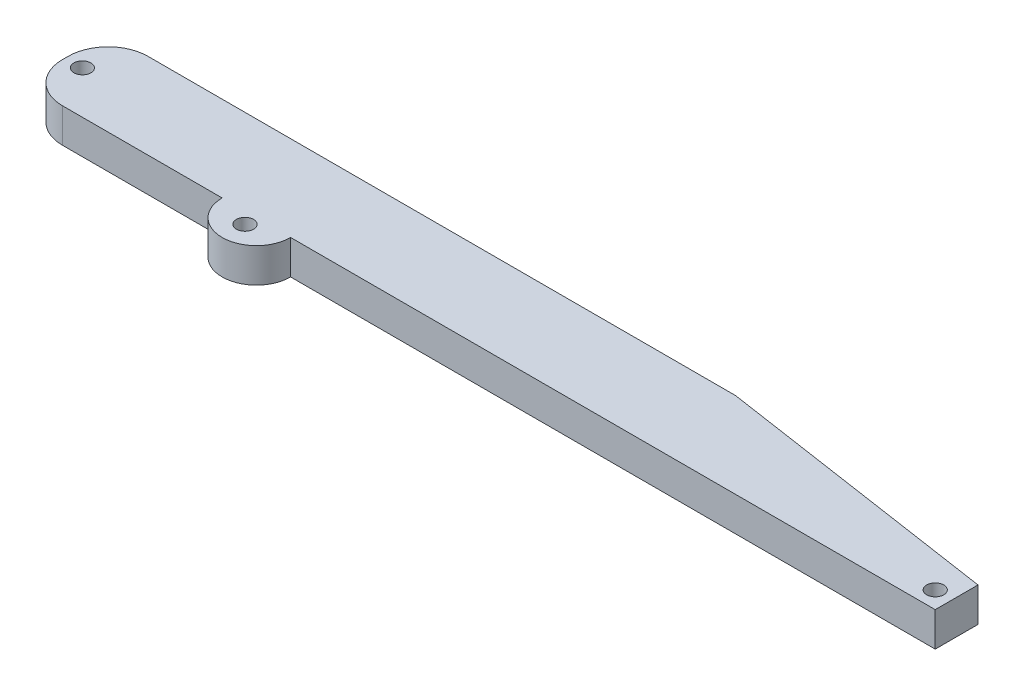
ISO-10303-21;
HEADER;
FILE_DESCRIPTION(('STEP AP214'),'2;1');
FILE_NAME('part.step','',(''),(''),'','','');
FILE_SCHEMA(('AUTOMOTIVE_DESIGN { 1 0 10303 214 1 1 1 1 }'));
ENDSEC;
DATA;
#1=APPLICATION_CONTEXT('core data for automotive mechanical design processes');
#2=APPLICATION_PROTOCOL_DEFINITION('international standard','automotive_design',2000,#1);
#3=PRODUCT_CONTEXT('',#1,'mechanical');
#4=PRODUCT('Part','Part','',(#3));
#5=PRODUCT_RELATED_PRODUCT_CATEGORY('part','',(#4));
#6=PRODUCT_DEFINITION_FORMATION('','',#4);
#7=PRODUCT_DEFINITION_CONTEXT('part definition',#1,'design');
#8=PRODUCT_DEFINITION('design','',#6,#7);
#9=PRODUCT_DEFINITION_SHAPE('','',#8);
#10=(LENGTH_UNIT() NAMED_UNIT(*) SI_UNIT(.MILLI.,.METRE.));
#11=(NAMED_UNIT(*) PLANE_ANGLE_UNIT() SI_UNIT($,.RADIAN.));
#12=(NAMED_UNIT(*) SI_UNIT($,.STERADIAN.) SOLID_ANGLE_UNIT());
#13=UNCERTAINTY_MEASURE_WITH_UNIT(LENGTH_MEASURE(1.E-05),#10,'distance_accuracy_value','');
#14=(GEOMETRIC_REPRESENTATION_CONTEXT(3) GLOBAL_UNCERTAINTY_ASSIGNED_CONTEXT((#13)) GLOBAL_UNIT_ASSIGNED_CONTEXT((#10,
#11,#12)) REPRESENTATION_CONTEXT('',''));
#15=CARTESIAN_POINT('',(0.,0.,0.));
#16=DIRECTION('',(0.,0.,1.));
#17=DIRECTION('',(1.,0.,0.));
#18=AXIS2_PLACEMENT_3D('',#15,#16,#17);
#19=CARTESIAN_POINT('',(-80.,6.,7.5));
#20=DIRECTION('',(0.,0.,-1.));
#21=DIRECTION('',(-1.,0.,0.));
#22=AXIS2_PLACEMENT_3D('',#19,#20,#21);
#23=PLANE('',#22);
#24=DIRECTION('',(0.,-1.,0.));
#25=VECTOR('',#24,1.);
#26=CARTESIAN_POINT('',(-33.,6.,7.5));
#27=LINE('',#26,#25);
#28=CARTESIAN_POINT('',(-33.,6.,7.5));
#29=VERTEX_POINT('',#28);
#30=CARTESIAN_POINT('',(-33.,0.,7.5));
#31=VERTEX_POINT('',#30);
#32=EDGE_CURVE('E197',#29,#31,#27,.T.);
#33=ORIENTED_EDGE('',*,*,#32,.T.);
#34=DIRECTION('',(1.,0.,0.));
#35=VECTOR('',#34,1.);
#36=CARTESIAN_POINT('',(-80.,0.,7.5));
#37=LINE('',#36,#35);
#38=CARTESIAN_POINT('',(80.,0.,7.5));
#39=VERTEX_POINT('',#38);
#40=EDGE_CURVE('E191',#31,#39,#37,.T.);
#41=ORIENTED_EDGE('',*,*,#40,.T.);
#42=DIRECTION('',(0.,-1.,0.));
#43=VECTOR('',#42,1.);
#44=CARTESIAN_POINT('',(80.,6.,7.5));
#45=LINE('',#44,#43);
#46=CARTESIAN_POINT('',(80.,6.,7.5));
#47=VERTEX_POINT('',#46);
#48=EDGE_CURVE('E135',#47,#39,#45,.T.);
#49=ORIENTED_EDGE('',*,*,#48,.F.);
#50=DIRECTION('',(1.,0.,0.));
#51=VECTOR('',#50,1.);
#52=CARTESIAN_POINT('',(-80.,6.,7.5));
#53=LINE('',#52,#51);
#54=EDGE_CURVE('E129',#29,#47,#53,.T.);
#55=ORIENTED_EDGE('',*,*,#54,.F.);
#56=EDGE_LOOP('',(#33,#41,#49,#55));
#57=FACE_BOUND('',#56,.T.);
#58=ADVANCED_FACE('F32',(#57),#23,.F.);
#59=CARTESIAN_POINT('',(-73.,6.,7.5));
#60=VERTEX_POINT('',#59);
#61=CARTESIAN_POINT('',(-45.,6.,7.5));
#62=VERTEX_POINT('',#61);
#63=EDGE_CURVE('E216',#60,#62,#53,.T.);
#64=ORIENTED_EDGE('',*,*,#63,.F.);
#65=DIRECTION('',(0.,-1.,0.));
#66=VECTOR('',#65,1.);
#67=CARTESIAN_POINT('',(-73.,6.,7.5));
#68=LINE('',#67,#66);
#69=CARTESIAN_POINT('',(-73.,0.,7.5));
#70=VERTEX_POINT('',#69);
#71=EDGE_CURVE('E11',#60,#70,#68,.T.);
#72=ORIENTED_EDGE('',*,*,#71,.T.);
#73=CARTESIAN_POINT('',(-45.,0.,7.5));
#74=VERTEX_POINT('',#73);
#75=EDGE_CURVE('E131',#70,#74,#37,.T.);
#76=ORIENTED_EDGE('',*,*,#75,.T.);
#77=DIRECTION('',(0.,-1.,0.));
#78=VECTOR('',#77,1.);
#79=CARTESIAN_POINT('',(-45.,6.,7.5));
#80=LINE('',#79,#78);
#81=EDGE_CURVE('E201',#62,#74,#80,.T.);
#82=ORIENTED_EDGE('',*,*,#81,.F.);
#83=EDGE_LOOP('',(#64,#72,#76,#82));
#84=FACE_BOUND('',#83,.T.);
#85=ADVANCED_FACE('F168',(#84),#23,.F.);
#86=CARTESIAN_POINT('',(-80.,6.,-7.5));
#87=DIRECTION('',(1.,0.,0.));
#88=DIRECTION('',(0.,0.,-1.));
#89=AXIS2_PLACEMENT_3D('',#86,#87,#88);
#90=PLANE('',#89);
#91=DIRECTION('',(0.,0.,1.));
#92=VECTOR('',#91,1.);
#93=CARTESIAN_POINT('',(-80.,6.,-7.5));
#94=LINE('',#93,#92);
#95=CARTESIAN_POINT('',(-80.,6.,-0.5));
#96=VERTEX_POINT('',#95);
#97=CARTESIAN_POINT('',(-80.,6.,0.5));
#98=VERTEX_POINT('',#97);
#99=EDGE_CURVE('E126',#96,#98,#94,.T.);
#100=ORIENTED_EDGE('',*,*,#99,.F.);
#101=DIRECTION('',(0.,-1.,0.));
#102=VECTOR('',#101,1.);
#103=CARTESIAN_POINT('',(-80.,6.,-0.5));
#104=LINE('',#103,#102);
#105=CARTESIAN_POINT('',(-80.,0.,-0.5));
#106=VERTEX_POINT('',#105);
#107=EDGE_CURVE('E140',#96,#106,#104,.T.);
#108=ORIENTED_EDGE('',*,*,#107,.T.);
#109=DIRECTION('',(0.,0.,1.));
#110=VECTOR('',#109,1.);
#111=CARTESIAN_POINT('',(-80.,0.,-7.5));
#112=LINE('',#111,#110);
#113=CARTESIAN_POINT('',(-80.,0.,0.5));
#114=VERTEX_POINT('',#113);
#115=EDGE_CURVE('E195',#106,#114,#112,.T.);
#116=ORIENTED_EDGE('',*,*,#115,.T.);
#117=DIRECTION('',(0.,-1.,0.));
#118=VECTOR('',#117,1.);
#119=CARTESIAN_POINT('',(-80.,6.,0.5));
#120=LINE('',#119,#118);
#121=EDGE_CURVE('E138',#114,#98,#120,.F.);
#122=ORIENTED_EDGE('',*,*,#121,.T.);
#123=EDGE_LOOP('',(#100,#108,#116,#122));
#124=FACE_BOUND('',#123,.T.);
#125=ADVANCED_FACE('F154',(#124),#90,.F.);
#126=CARTESIAN_POINT('',(80.,6.,-7.5));
#127=DIRECTION('',(-1.,0.,0.));
#128=DIRECTION('',(0.,0.,1.));
#129=AXIS2_PLACEMENT_3D('',#126,#127,#128);
#130=PLANE('',#129);
#131=DIRECTION('',(0.,0.,-1.));
#132=VECTOR('',#131,1.);
#133=CARTESIAN_POINT('',(80.,0.,-7.5));
#134=LINE('',#133,#132);
#135=CARTESIAN_POINT('',(80.,0.,0.));
#136=VERTEX_POINT('',#135);
#137=EDGE_CURVE('E127',#39,#136,#134,.T.);
#138=ORIENTED_EDGE('',*,*,#137,.T.);
#139=DIRECTION('',(0.,1.,0.));
#140=VECTOR('',#139,1.);
#141=CARTESIAN_POINT('',(80.,0.,0.));
#142=LINE('',#141,#140);
#143=CARTESIAN_POINT('',(80.,6.,0.));
#144=VERTEX_POINT('',#143);
#145=EDGE_CURVE('E111',#136,#144,#142,.T.);
#146=ORIENTED_EDGE('',*,*,#145,.T.);
#147=DIRECTION('',(0.,0.,-1.));
#148=VECTOR('',#147,1.);
#149=CARTESIAN_POINT('',(80.,6.,-7.5));
#150=LINE('',#149,#148);
#151=EDGE_CURVE('E218',#47,#144,#150,.T.);
#152=ORIENTED_EDGE('',*,*,#151,.F.);
#153=ORIENTED_EDGE('',*,*,#48,.T.);
#154=EDGE_LOOP('',(#138,#146,#152,#153));
#155=FACE_BOUND('',#154,.T.);
#156=ADVANCED_FACE('F177',(#155),#130,.F.);
#157=CARTESIAN_POINT('',(-80.,6.,-7.5));
#158=DIRECTION('',(0.,0.,1.));
#159=DIRECTION('',(1.,0.,0.));
#160=AXIS2_PLACEMENT_3D('',#157,#158,#159);
#161=PLANE('',#160);
#162=DIRECTION('',(-1.,0.,0.));
#163=VECTOR('',#162,1.);
#164=CARTESIAN_POINT('',(-80.,0.,-7.5));
#165=LINE('',#164,#163);
#166=CARTESIAN_POINT('',(30.,0.,-7.5));
#167=VERTEX_POINT('',#166);
#168=CARTESIAN_POINT('',(-73.,0.,-7.5));
#169=VERTEX_POINT('',#168);
#170=EDGE_CURVE('E119',#167,#169,#165,.T.);
#171=ORIENTED_EDGE('',*,*,#170,.T.);
#172=DIRECTION('',(0.,-1.,0.));
#173=VECTOR('',#172,1.);
#174=CARTESIAN_POINT('',(-73.,6.,-7.5));
#175=LINE('',#174,#173);
#176=CARTESIAN_POINT('',(-73.,6.,-7.5));
#177=VERTEX_POINT('',#176);
#178=EDGE_CURVE('E55',#169,#177,#175,.F.);
#179=ORIENTED_EDGE('',*,*,#178,.T.);
#180=DIRECTION('',(-1.,0.,0.));
#181=VECTOR('',#180,1.);
#182=CARTESIAN_POINT('',(-80.,6.,-7.5));
#183=LINE('',#182,#181);
#184=CARTESIAN_POINT('',(30.,6.,-7.5));
#185=VERTEX_POINT('',#184);
#186=EDGE_CURVE('E120',#185,#177,#183,.T.);
#187=ORIENTED_EDGE('',*,*,#186,.F.);
#188=DIRECTION('',(0.,1.,0.));
#189=VECTOR('',#188,1.);
#190=CARTESIAN_POINT('',(30.,0.,-7.5));
#191=LINE('',#190,#189);
#192=EDGE_CURVE('E108',#167,#185,#191,.T.);
#193=ORIENTED_EDGE('',*,*,#192,.F.);
#194=EDGE_LOOP('',(#171,#179,#187,#193));
#195=FACE_BOUND('',#194,.T.);
#196=ADVANCED_FACE('F118',(#195),#161,.F.);
#197=CARTESIAN_POINT('',(0.,6.,0.));
#198=DIRECTION('',(0.,1.,0.));
#199=DIRECTION('',(0.,0.,1.));
#200=AXIS2_PLACEMENT_3D('',#197,#198,#199);
#201=PLANE('',#200);
#202=ORIENTED_EDGE('',*,*,#186,.T.);
#203=CARTESIAN_POINT('',(-73.,6.,-0.5));
#204=DIRECTION('',(0.,1.,0.));
#205=DIRECTION('',(0.,0.,1.));
#206=AXIS2_PLACEMENT_3D('',#203,#204,#205);
#207=CIRCLE('',#206,7.);
#208=EDGE_CURVE('E40',#177,#96,#207,.T.);
#209=ORIENTED_EDGE('',*,*,#208,.T.);
#210=ORIENTED_EDGE('',*,*,#99,.T.);
#211=CARTESIAN_POINT('',(-73.,6.,0.5));
#212=DIRECTION('',(0.,1.,0.));
#213=DIRECTION('',(0.,0.,1.));
#214=AXIS2_PLACEMENT_3D('',#211,#212,#213);
#215=CIRCLE('',#214,7.);
#216=EDGE_CURVE('E47',#98,#60,#215,.T.);
#217=ORIENTED_EDGE('',*,*,#216,.T.);
#218=ORIENTED_EDGE('',*,*,#63,.T.);
#219=CARTESIAN_POINT('',(-39.,6.,7.5));
#220=DIRECTION('',(0.,1.,0.));
#221=DIRECTION('',(0.,0.,1.));
#222=AXIS2_PLACEMENT_3D('',#219,#220,#221);
#223=CIRCLE('',#222,6.);
#224=EDGE_CURVE('E206',#62,#29,#223,.T.);
#225=ORIENTED_EDGE('',*,*,#224,.T.);
#226=ORIENTED_EDGE('',*,*,#54,.T.);
#227=ORIENTED_EDGE('',*,*,#151,.T.);
#228=DIRECTION('',(0.988936352868298,0.,0.148340452930245));
#229=VECTOR('',#228,1.);
#230=CARTESIAN_POINT('',(30.,6.,-7.5));
#231=LINE('',#230,#229);
#232=EDGE_CURVE('E116',#185,#144,#231,.T.);
#233=ORIENTED_EDGE('',*,*,#232,.F.);
#234=EDGE_LOOP('',(#202,#209,#210,#217,#218,#225,#226,#227,#233));
#235=FACE_BOUND('',#234,.T.);
#236=CARTESIAN_POINT('',(-77.,6.,0.));
#237=DIRECTION('',(0.,1.,0.));
#238=DIRECTION('',(0.,0.,1.));
#239=AXIS2_PLACEMENT_3D('',#236,#237,#238);
#240=CIRCLE('',#239,1.5);
#241=CARTESIAN_POINT('',(-77.,6.,1.5));
#242=VERTEX_POINT('',#241);
#243=EDGE_CURVE('E211',#242,#242,#240,.T.);
#244=ORIENTED_EDGE('',*,*,#243,.F.);
#245=EDGE_LOOP('',(#244));
#246=FACE_BOUND('',#245,.T.);
#247=CARTESIAN_POINT('',(-39.,6.,9.5));
#248=DIRECTION('',(0.,1.,0.));
#249=DIRECTION('',(0.,0.,1.));
#250=AXIS2_PLACEMENT_3D('',#247,#248,#249);
#251=CIRCLE('',#250,1.5);
#252=CARTESIAN_POINT('',(-39.,6.,11.));
#253=VERTEX_POINT('',#252);
#254=EDGE_CURVE('E230',#253,#253,#251,.T.);
#255=ORIENTED_EDGE('',*,*,#254,.F.);
#256=EDGE_LOOP('',(#255));
#257=FACE_BOUND('',#256,.T.);
#258=CARTESIAN_POINT('',(77.,6.,4.5));
#259=DIRECTION('',(0.,1.,0.));
#260=DIRECTION('',(0.,0.,1.));
#261=AXIS2_PLACEMENT_3D('',#258,#259,#260);
#262=CIRCLE('',#261,1.5);
#263=CARTESIAN_POINT('',(77.,6.,6.));
#264=VERTEX_POINT('',#263);
#265=EDGE_CURVE('E121',#264,#264,#262,.T.);
#266=ORIENTED_EDGE('',*,*,#265,.F.);
#267=EDGE_LOOP('',(#266));
#268=FACE_BOUND('',#267,.T.);
#269=ADVANCED_FACE('F149',(#235,#246,#257,#268),#201,.T.);
#270=CARTESIAN_POINT('',(0.,0.,0.));
#271=DIRECTION('',(0.,1.,0.));
#272=DIRECTION('',(0.,0.,1.));
#273=AXIS2_PLACEMENT_3D('',#270,#271,#272);
#274=PLANE('',#273);
#275=CARTESIAN_POINT('',(-77.,0.,0.));
#276=DIRECTION('',(0.,1.,0.));
#277=DIRECTION('',(0.,0.,1.));
#278=AXIS2_PLACEMENT_3D('',#275,#276,#277);
#279=CIRCLE('',#278,1.5);
#280=CARTESIAN_POINT('',(-77.,0.,1.5));
#281=VERTEX_POINT('',#280);
#282=EDGE_CURVE('E207',#281,#281,#279,.T.);
#283=ORIENTED_EDGE('',*,*,#282,.T.);
#284=EDGE_LOOP('',(#283));
#285=FACE_BOUND('',#284,.T.);
#286=CARTESIAN_POINT('',(-39.,0.,9.5));
#287=DIRECTION('',(0.,1.,0.));
#288=DIRECTION('',(0.,0.,1.));
#289=AXIS2_PLACEMENT_3D('',#286,#287,#288);
#290=CIRCLE('',#289,1.5);
#291=CARTESIAN_POINT('',(-39.,0.,11.));
#292=VERTEX_POINT('',#291);
#293=EDGE_CURVE('E227',#292,#292,#290,.T.);
#294=ORIENTED_EDGE('',*,*,#293,.T.);
#295=EDGE_LOOP('',(#294));
#296=FACE_BOUND('',#295,.T.);
#297=CARTESIAN_POINT('',(77.,0.,4.5));
#298=DIRECTION('',(0.,1.,0.));
#299=DIRECTION('',(0.,0.,1.));
#300=AXIS2_PLACEMENT_3D('',#297,#298,#299);
#301=CIRCLE('',#300,1.5);
#302=CARTESIAN_POINT('',(77.,0.,6.));
#303=VERTEX_POINT('',#302);
#304=EDGE_CURVE('E233',#303,#303,#301,.T.);
#305=ORIENTED_EDGE('',*,*,#304,.T.);
#306=EDGE_LOOP('',(#305));
#307=FACE_BOUND('',#306,.T.);
#308=ORIENTED_EDGE('',*,*,#115,.F.);
#309=CARTESIAN_POINT('',(-73.,0.,-0.5));
#310=DIRECTION('',(0.,1.,0.));
#311=DIRECTION('',(0.,0.,1.));
#312=AXIS2_PLACEMENT_3D('',#309,#310,#311);
#313=CIRCLE('',#312,7.);
#314=EDGE_CURVE('E125',#106,#169,#313,.F.);
#315=ORIENTED_EDGE('',*,*,#314,.T.);
#316=ORIENTED_EDGE('',*,*,#170,.F.);
#317=DIRECTION('',(0.988936352868298,0.,0.148340452930245));
#318=VECTOR('',#317,1.);
#319=CARTESIAN_POINT('',(30.,0.,-7.5));
#320=LINE('',#319,#318);
#321=EDGE_CURVE('E105',#167,#136,#320,.T.);
#322=ORIENTED_EDGE('',*,*,#321,.T.);
#323=ORIENTED_EDGE('',*,*,#137,.F.);
#324=ORIENTED_EDGE('',*,*,#40,.F.);
#325=CARTESIAN_POINT('',(-39.,0.,7.5));
#326=DIRECTION('',(0.,1.,0.));
#327=DIRECTION('',(0.,0.,1.));
#328=AXIS2_PLACEMENT_3D('',#325,#326,#327);
#329=CIRCLE('',#328,6.);
#330=EDGE_CURVE('E194',#74,#31,#329,.T.);
#331=ORIENTED_EDGE('',*,*,#330,.F.);
#332=ORIENTED_EDGE('',*,*,#75,.F.);
#333=CARTESIAN_POINT('',(-73.,0.,0.5));
#334=DIRECTION('',(0.,1.,0.));
#335=DIRECTION('',(0.,0.,1.));
#336=AXIS2_PLACEMENT_3D('',#333,#334,#335);
#337=CIRCLE('',#336,7.);
#338=EDGE_CURVE('E143',#70,#114,#337,.F.);
#339=ORIENTED_EDGE('',*,*,#338,.T.);
#340=EDGE_LOOP('',(#308,#315,#316,#322,#323,#324,#331,#332,#339));
#341=FACE_BOUND('',#340,.T.);
#342=ADVANCED_FACE('F124',(#285,#296,#307,#341),#274,.F.);
#343=CARTESIAN_POINT('',(-39.,6.,7.5));
#344=DIRECTION('',(0.,-1.,0.));
#345=DIRECTION('',(0.,0.,-1.));
#346=AXIS2_PLACEMENT_3D('',#343,#344,#345);
#347=CYLINDRICAL_SURFACE('',#346,6.);
#348=ORIENTED_EDGE('',*,*,#330,.T.);
#349=ORIENTED_EDGE('',*,*,#32,.F.);
#350=ORIENTED_EDGE('',*,*,#224,.F.);
#351=ORIENTED_EDGE('',*,*,#81,.T.);
#352=EDGE_LOOP('',(#348,#349,#350,#351));
#353=FACE_BOUND('',#352,.T.);
#354=ADVANCED_FACE('F204',(#353),#347,.T.);
#355=CARTESIAN_POINT('',(77.,0.,4.5));
#356=DIRECTION('',(0.,1.,0.));
#357=DIRECTION('',(0.,0.,1.));
#358=AXIS2_PLACEMENT_3D('',#355,#356,#357);
#359=CYLINDRICAL_SURFACE('',#358,1.5);
#360=ORIENTED_EDGE('',*,*,#304,.F.);
#361=EDGE_LOOP('',(#360));
#362=FACE_BOUND('',#361,.T.);
#363=ORIENTED_EDGE('',*,*,#265,.T.);
#364=EDGE_LOOP('',(#363));
#365=FACE_BOUND('',#364,.T.);
#366=ADVANCED_FACE('F238',(#362,#365),#359,.F.);
#367=CARTESIAN_POINT('',(-39.,0.,9.5));
#368=DIRECTION('',(0.,1.,0.));
#369=DIRECTION('',(0.,0.,1.));
#370=AXIS2_PLACEMENT_3D('',#367,#368,#369);
#371=CYLINDRICAL_SURFACE('',#370,1.5);
#372=ORIENTED_EDGE('',*,*,#293,.F.);
#373=EDGE_LOOP('',(#372));
#374=FACE_BOUND('',#373,.T.);
#375=ORIENTED_EDGE('',*,*,#254,.T.);
#376=EDGE_LOOP('',(#375));
#377=FACE_BOUND('',#376,.T.);
#378=ADVANCED_FACE('F252',(#374,#377),#371,.F.);
#379=CARTESIAN_POINT('',(-77.,0.,0.));
#380=DIRECTION('',(0.,1.,0.));
#381=DIRECTION('',(0.,0.,1.));
#382=AXIS2_PLACEMENT_3D('',#379,#380,#381);
#383=CYLINDRICAL_SURFACE('',#382,1.5);
#384=ORIENTED_EDGE('',*,*,#282,.F.);
#385=EDGE_LOOP('',(#384));
#386=FACE_BOUND('',#385,.T.);
#387=ORIENTED_EDGE('',*,*,#243,.T.);
#388=EDGE_LOOP('',(#387));
#389=FACE_BOUND('',#388,.T.);
#390=ADVANCED_FACE('F164',(#386,#389),#383,.F.);
#391=CARTESIAN_POINT('',(30.,0.,-7.5));
#392=DIRECTION('',(-0.148340452930245,0.,0.988936352868298));
#393=DIRECTION('',(0.988936352868298,0.,0.148340452930245));
#394=AXIS2_PLACEMENT_3D('',#391,#392,#393);
#395=PLANE('',#394);
#396=ORIENTED_EDGE('',*,*,#232,.T.);
#397=ORIENTED_EDGE('',*,*,#145,.F.);
#398=ORIENTED_EDGE('',*,*,#321,.F.);
#399=ORIENTED_EDGE('',*,*,#192,.T.);
#400=EDGE_LOOP('',(#396,#397,#398,#399));
#401=FACE_BOUND('',#400,.T.);
#402=ADVANCED_FACE('F107',(#401),#395,.F.);
#403=CARTESIAN_POINT('',(-73.,6.,-0.5));
#404=DIRECTION('',(0.,-1.,0.));
#405=DIRECTION('',(0.,0.,-1.));
#406=AXIS2_PLACEMENT_3D('',#403,#404,#405);
#407=CYLINDRICAL_SURFACE('',#406,7.);
#408=ORIENTED_EDGE('',*,*,#208,.F.);
#409=ORIENTED_EDGE('',*,*,#178,.F.);
#410=ORIENTED_EDGE('',*,*,#314,.F.);
#411=ORIENTED_EDGE('',*,*,#107,.F.);
#412=EDGE_LOOP('',(#408,#409,#410,#411));
#413=FACE_BOUND('',#412,.T.);
#414=ADVANCED_FACE('F157',(#413),#407,.T.);
#415=CARTESIAN_POINT('',(-73.,6.,0.5));
#416=DIRECTION('',(0.,-1.,0.));
#417=DIRECTION('',(0.,0.,-1.));
#418=AXIS2_PLACEMENT_3D('',#415,#416,#417);
#419=CYLINDRICAL_SURFACE('',#418,7.);
#420=ORIENTED_EDGE('',*,*,#216,.F.);
#421=ORIENTED_EDGE('',*,*,#121,.F.);
#422=ORIENTED_EDGE('',*,*,#338,.F.);
#423=ORIENTED_EDGE('',*,*,#71,.F.);
#424=EDGE_LOOP('',(#420,#421,#422,#423));
#425=FACE_BOUND('',#424,.T.);
#426=ADVANCED_FACE('F34',(#425),#419,.T.);
#427=CLOSED_SHELL('',(#58,#85,#125,#156,#196,#269,#342,#354,#366,#378,#390,#402,#414,#426));
#428=MANIFOLD_SOLID_BREP('B2',#427);
#429=ADVANCED_BREP_SHAPE_REPRESENTATION('',(#18,#428),#14);
#430=SHAPE_DEFINITION_REPRESENTATION(#9,#429);
ENDSEC;
END-ISO-10303-21;
